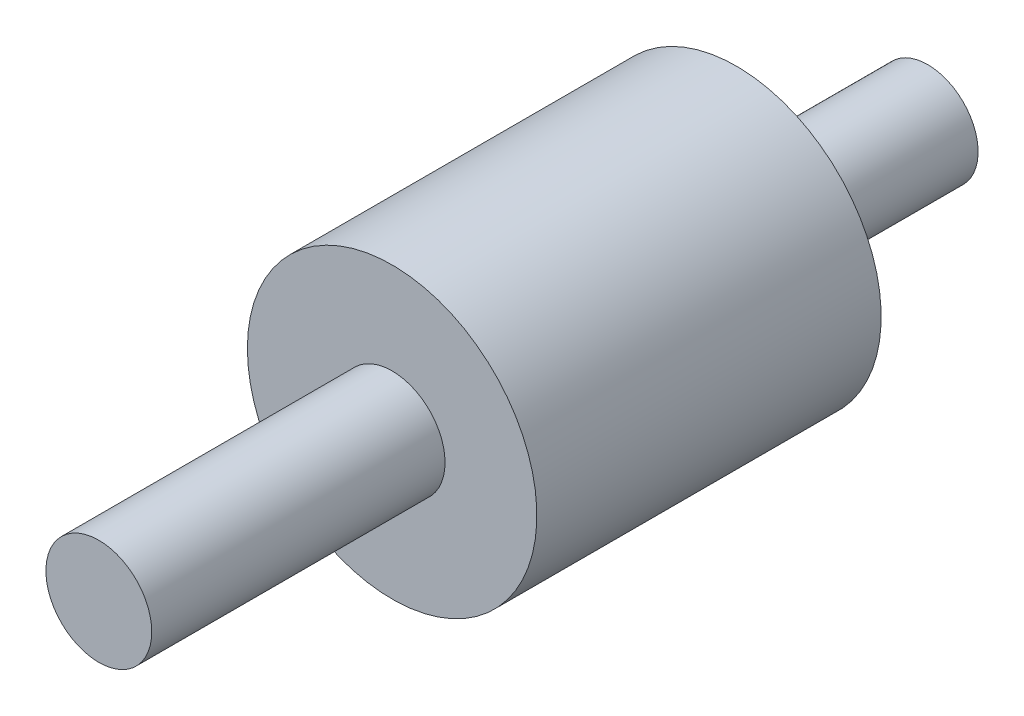
ISO-10303-21;
HEADER;
FILE_DESCRIPTION(('STEP AP214'),'2;1');
FILE_NAME('part.step','',(''),(''),'','','');
FILE_SCHEMA(('AUTOMOTIVE_DESIGN { 1 0 10303 214 1 1 1 1 }'));
ENDSEC;
DATA;
#1=APPLICATION_CONTEXT('core data for automotive mechanical design processes');
#2=APPLICATION_PROTOCOL_DEFINITION('international standard','automotive_design',2000,#1);
#3=PRODUCT_CONTEXT('',#1,'mechanical');
#4=PRODUCT('Part','Part','',(#3));
#5=PRODUCT_RELATED_PRODUCT_CATEGORY('part','',(#4));
#6=PRODUCT_DEFINITION_FORMATION('','',#4);
#7=PRODUCT_DEFINITION_CONTEXT('part definition',#1,'design');
#8=PRODUCT_DEFINITION('design','',#6,#7);
#9=PRODUCT_DEFINITION_SHAPE('','',#8);
#10=(LENGTH_UNIT() NAMED_UNIT(*) SI_UNIT(.MILLI.,.METRE.));
#11=(NAMED_UNIT(*) PLANE_ANGLE_UNIT() SI_UNIT($,.RADIAN.));
#12=(NAMED_UNIT(*) SI_UNIT($,.STERADIAN.) SOLID_ANGLE_UNIT());
#13=UNCERTAINTY_MEASURE_WITH_UNIT(LENGTH_MEASURE(1.E-05),#10,'distance_accuracy_value','');
#14=(GEOMETRIC_REPRESENTATION_CONTEXT(3) GLOBAL_UNCERTAINTY_ASSIGNED_CONTEXT((#13)) GLOBAL_UNIT_ASSIGNED_CONTEXT((#10,
#11,#12)) REPRESENTATION_CONTEXT('',''));
#15=CARTESIAN_POINT('',(0.,0.,0.));
#16=DIRECTION('',(0.,0.,1.));
#17=DIRECTION('',(1.,0.,0.));
#18=AXIS2_PLACEMENT_3D('',#15,#16,#17);
#19=CARTESIAN_POINT('',(0.,0.,23.));
#20=DIRECTION('',(0.,0.,-1.));
#21=DIRECTION('',(-1.,0.,0.));
#22=AXIS2_PLACEMENT_3D('',#19,#20,#21);
#23=CYLINDRICAL_SURFACE('',#22,4.15);
#24=CARTESIAN_POINT('',(0.,0.,23.));
#25=DIRECTION('',(0.,0.,1.));
#26=DIRECTION('',(1.,0.,0.));
#27=AXIS2_PLACEMENT_3D('',#24,#25,#26);
#28=CIRCLE('',#27,4.15);
#29=CARTESIAN_POINT('',(4.15,0.,23.));
#30=VERTEX_POINT('',#29);
#31=EDGE_CURVE('E38',#30,#30,#28,.T.);
#32=ORIENTED_EDGE('',*,*,#31,.F.);
#33=EDGE_LOOP('',(#32));
#34=FACE_BOUND('',#33,.T.);
#35=CARTESIAN_POINT('',(0.,0.,0.));
#36=DIRECTION('',(0.,0.,1.));
#37=DIRECTION('',(1.,0.,0.));
#38=AXIS2_PLACEMENT_3D('',#35,#36,#37);
#39=CIRCLE('',#38,4.15);
#40=CARTESIAN_POINT('',(4.15,0.,0.));
#41=VERTEX_POINT('',#40);
#42=EDGE_CURVE('E34',#41,#41,#39,.T.);
#43=ORIENTED_EDGE('',*,*,#42,.T.);
#44=EDGE_LOOP('',(#43));
#45=FACE_BOUND('',#44,.T.);
#46=ADVANCED_FACE('F31',(#34,#45),#23,.T.);
#47=CARTESIAN_POINT('',(0.,0.,23.));
#48=DIRECTION('',(0.,0.,1.));
#49=DIRECTION('',(1.,0.,0.));
#50=AXIS2_PLACEMENT_3D('',#47,#48,#49);
#51=PLANE('',#50);
#52=ORIENTED_EDGE('',*,*,#31,.T.);
#53=EDGE_LOOP('',(#52));
#54=FACE_BOUND('',#53,.T.);
#55=ADVANCED_FACE('F72',(#54),#51,.T.);
#56=CARTESIAN_POINT('',(0.,0.,-27.));
#57=DIRECTION('',(0.,0.,1.));
#58=DIRECTION('',(1.,0.,0.));
#59=AXIS2_PLACEMENT_3D('',#56,#57,#58);
#60=CYLINDRICAL_SURFACE('',#59,11.35);
#61=CARTESIAN_POINT('',(0.,0.,-27.));
#62=DIRECTION('',(0.,0.,-1.));
#63=DIRECTION('',(-1.,0.,0.));
#64=AXIS2_PLACEMENT_3D('',#61,#62,#63);
#65=CIRCLE('',#64,11.35);
#66=CARTESIAN_POINT('',(-11.35,0.,-27.));
#67=VERTEX_POINT('',#66);
#68=EDGE_CURVE('E46',#67,#67,#65,.T.);
#69=ORIENTED_EDGE('',*,*,#68,.F.);
#70=EDGE_LOOP('',(#69));
#71=FACE_BOUND('',#70,.T.);
#72=CARTESIAN_POINT('',(0.,0.,0.));
#73=DIRECTION('',(0.,0.,-1.));
#74=DIRECTION('',(-1.,0.,0.));
#75=AXIS2_PLACEMENT_3D('',#72,#73,#74);
#76=CIRCLE('',#75,11.35);
#77=CARTESIAN_POINT('',(-11.35,0.,0.));
#78=VERTEX_POINT('',#77);
#79=EDGE_CURVE('E49',#78,#78,#76,.T.);
#80=ORIENTED_EDGE('',*,*,#79,.T.);
#81=EDGE_LOOP('',(#80));
#82=FACE_BOUND('',#81,.T.);
#83=ADVANCED_FACE('F77',(#71,#82),#60,.T.);
#84=CARTESIAN_POINT('',(0.,0.,-27.));
#85=DIRECTION('',(0.,0.,-1.));
#86=DIRECTION('',(-1.,0.,0.));
#87=AXIS2_PLACEMENT_3D('',#84,#85,#86);
#88=PLANE('',#87);
#89=CARTESIAN_POINT('',(0.,0.,-27.));
#90=DIRECTION('',(0.,0.,-1.));
#91=DIRECTION('',(-1.,0.,0.));
#92=AXIS2_PLACEMENT_3D('',#89,#90,#91);
#93=CIRCLE('',#92,3.95);
#94=CARTESIAN_POINT('',(-3.95,0.,-27.));
#95=VERTEX_POINT('',#94);
#96=EDGE_CURVE('E10',#95,#95,#93,.T.);
#97=ORIENTED_EDGE('',*,*,#96,.F.);
#98=EDGE_LOOP('',(#97));
#99=FACE_BOUND('',#98,.T.);
#100=ORIENTED_EDGE('',*,*,#68,.T.);
#101=EDGE_LOOP('',(#100));
#102=FACE_BOUND('',#101,.T.);
#103=ADVANCED_FACE('F67',(#99,#102),#88,.T.);
#104=CARTESIAN_POINT('',(0.,0.,0.));
#105=DIRECTION('',(0.,0.,-1.));
#106=DIRECTION('',(-1.,0.,0.));
#107=AXIS2_PLACEMENT_3D('',#104,#105,#106);
#108=PLANE('',#107);
#109=ORIENTED_EDGE('',*,*,#42,.F.);
#110=EDGE_LOOP('',(#109));
#111=FACE_BOUND('',#110,.T.);
#112=ORIENTED_EDGE('',*,*,#79,.F.);
#113=EDGE_LOOP('',(#112));
#114=FACE_BOUND('',#113,.T.);
#115=ADVANCED_FACE('F60',(#111,#114),#108,.F.);
#116=CARTESIAN_POINT('',(0.,0.,-42.));
#117=DIRECTION('',(0.,0.,1.));
#118=DIRECTION('',(1.,0.,0.));
#119=AXIS2_PLACEMENT_3D('',#116,#117,#118);
#120=CYLINDRICAL_SURFACE('',#119,3.95);
#121=CARTESIAN_POINT('',(0.,0.,-42.));
#122=DIRECTION('',(0.,0.,-1.));
#123=DIRECTION('',(-1.,0.,0.));
#124=AXIS2_PLACEMENT_3D('',#121,#122,#123);
#125=CIRCLE('',#124,3.95);
#126=CARTESIAN_POINT('',(-3.95,0.,-42.));
#127=VERTEX_POINT('',#126);
#128=EDGE_CURVE('E45',#127,#127,#125,.T.);
#129=ORIENTED_EDGE('',*,*,#128,.F.);
#130=EDGE_LOOP('',(#129));
#131=FACE_BOUND('',#130,.T.);
#132=ORIENTED_EDGE('',*,*,#96,.T.);
#133=EDGE_LOOP('',(#132));
#134=FACE_BOUND('',#133,.T.);
#135=ADVANCED_FACE('F58',(#131,#134),#120,.T.);
#136=CARTESIAN_POINT('',(0.,0.,-42.));
#137=DIRECTION('',(0.,0.,-1.));
#138=DIRECTION('',(-1.,0.,0.));
#139=AXIS2_PLACEMENT_3D('',#136,#137,#138);
#140=PLANE('',#139);
#141=ORIENTED_EDGE('',*,*,#128,.T.);
#142=EDGE_LOOP('',(#141));
#143=FACE_BOUND('',#142,.T.);
#144=ADVANCED_FACE('F56',(#143),#140,.T.);
#145=CLOSED_SHELL('',(#46,#55,#83,#103,#115,#135,#144));
#146=MANIFOLD_SOLID_BREP('B2',#145);
#147=ADVANCED_BREP_SHAPE_REPRESENTATION('',(#18,#146),#14);
#148=SHAPE_DEFINITION_REPRESENTATION(#9,#147);
ENDSEC;
END-ISO-10303-21;
